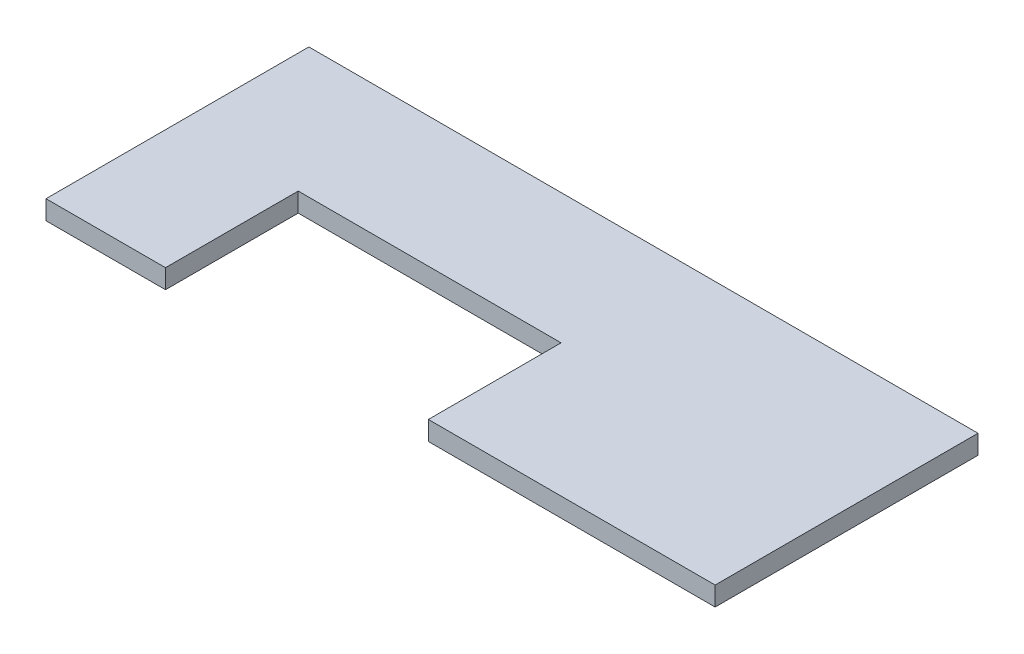
ISO-10303-21;
HEADER;
FILE_DESCRIPTION(('STEP AP214'),'2;1');
FILE_NAME('part.step','',(''),(''),'','','');
FILE_SCHEMA(('AUTOMOTIVE_DESIGN { 1 0 10303 214 1 1 1 1 }'));
ENDSEC;
DATA;
#1=APPLICATION_CONTEXT('core data for automotive mechanical design processes');
#2=APPLICATION_PROTOCOL_DEFINITION('international standard','automotive_design',2000,#1);
#3=PRODUCT_CONTEXT('',#1,'mechanical');
#4=PRODUCT('Part','Part','',(#3));
#5=PRODUCT_RELATED_PRODUCT_CATEGORY('part','',(#4));
#6=PRODUCT_DEFINITION_FORMATION('','',#4);
#7=PRODUCT_DEFINITION_CONTEXT('part definition',#1,'design');
#8=PRODUCT_DEFINITION('design','',#6,#7);
#9=PRODUCT_DEFINITION_SHAPE('','',#8);
#10=(LENGTH_UNIT() NAMED_UNIT(*) SI_UNIT(.MILLI.,.METRE.));
#11=(NAMED_UNIT(*) PLANE_ANGLE_UNIT() SI_UNIT($,.RADIAN.));
#12=(NAMED_UNIT(*) SI_UNIT($,.STERADIAN.) SOLID_ANGLE_UNIT());
#13=UNCERTAINTY_MEASURE_WITH_UNIT(LENGTH_MEASURE(1.E-05),#10,'distance_accuracy_value','');
#14=(GEOMETRIC_REPRESENTATION_CONTEXT(3) GLOBAL_UNCERTAINTY_ASSIGNED_CONTEXT((#13)) GLOBAL_UNIT_ASSIGNED_CONTEXT((#10,
#11,#12)) REPRESENTATION_CONTEXT('',''));
#15=CARTESIAN_POINT('',(0.,0.,0.));
#16=DIRECTION('',(0.,0.,1.));
#17=DIRECTION('',(1.,0.,0.));
#18=AXIS2_PLACEMENT_3D('',#15,#16,#17);
#19=CARTESIAN_POINT('',(-196.239669421488,4.,-35.2892561983471));
#20=DIRECTION('',(1.,0.,0.));
#21=DIRECTION('',(0.,0.,-1.));
#22=AXIS2_PLACEMENT_3D('',#19,#20,#21);
#23=PLANE('',#22);
#24=DIRECTION('',(0.,0.,1.));
#25=VECTOR('',#24,1.);
#26=CARTESIAN_POINT('',(-196.239669421488,0.,-35.2892561983471));
#27=LINE('',#26,#25);
#28=CARTESIAN_POINT('',(-196.239669421488,0.,-90.2892561983471));
#29=VERTEX_POINT('',#28);
#30=CARTESIAN_POINT('',(-196.239669421488,0.,-35.2892561983471));
#31=VERTEX_POINT('',#30);
#32=EDGE_CURVE('E129',#29,#31,#27,.T.);
#33=ORIENTED_EDGE('',*,*,#32,.T.);
#34=DIRECTION('',(0.,-1.,0.));
#35=VECTOR('',#34,1.);
#36=CARTESIAN_POINT('',(-196.239669421488,4.,-35.2892561983471));
#37=LINE('',#36,#35);
#38=CARTESIAN_POINT('',(-196.239669421488,4.,-35.2892561983471));
#39=VERTEX_POINT('',#38);
#40=EDGE_CURVE('E11',#39,#31,#37,.T.);
#41=ORIENTED_EDGE('',*,*,#40,.F.);
#42=DIRECTION('',(0.,0.,1.));
#43=VECTOR('',#42,1.);
#44=CARTESIAN_POINT('',(-196.239669421488,4.,-35.2892561983471));
#45=LINE('',#44,#43);
#46=CARTESIAN_POINT('',(-196.239669421488,4.,-90.2892561983471));
#47=VERTEX_POINT('',#46);
#48=EDGE_CURVE('E143',#47,#39,#45,.T.);
#49=ORIENTED_EDGE('',*,*,#48,.F.);
#50=DIRECTION('',(0.,-1.,0.));
#51=VECTOR('',#50,1.);
#52=CARTESIAN_POINT('',(-196.239669421488,4.,-90.2892561983471));
#53=LINE('',#52,#51);
#54=EDGE_CURVE('E125',#47,#29,#53,.T.);
#55=ORIENTED_EDGE('',*,*,#54,.T.);
#56=EDGE_LOOP('',(#33,#41,#49,#55));
#57=FACE_BOUND('',#56,.T.);
#58=ADVANCED_FACE('F33',(#57),#23,.F.);
#59=CARTESIAN_POINT('',(-171.239669421488,4.,-35.2892561983471));
#60=DIRECTION('',(0.,0.,-1.));
#61=DIRECTION('',(-1.,0.,0.));
#62=AXIS2_PLACEMENT_3D('',#59,#60,#61);
#63=PLANE('',#62);
#64=DIRECTION('',(1.,0.,0.));
#65=VECTOR('',#64,1.);
#66=CARTESIAN_POINT('',(-171.239669421488,0.,-35.2892561983471));
#67=LINE('',#66,#65);
#68=CARTESIAN_POINT('',(-171.239669421488,0.,-35.2892561983471));
#69=VERTEX_POINT('',#68);
#70=EDGE_CURVE('E132',#31,#69,#67,.T.);
#71=ORIENTED_EDGE('',*,*,#70,.T.);
#72=DIRECTION('',(0.,-1.,0.));
#73=VECTOR('',#72,1.);
#74=CARTESIAN_POINT('',(-171.239669421488,4.,-35.2892561983471));
#75=LINE('',#74,#73);
#76=CARTESIAN_POINT('',(-171.239669421488,4.,-35.2892561983471));
#77=VERTEX_POINT('',#76);
#78=EDGE_CURVE('E41',#77,#69,#75,.T.);
#79=ORIENTED_EDGE('',*,*,#78,.F.);
#80=DIRECTION('',(1.,0.,0.));
#81=VECTOR('',#80,1.);
#82=CARTESIAN_POINT('',(-171.239669421488,4.,-35.2892561983471));
#83=LINE('',#82,#81);
#84=EDGE_CURVE('E92',#39,#77,#83,.T.);
#85=ORIENTED_EDGE('',*,*,#84,.F.);
#86=ORIENTED_EDGE('',*,*,#40,.T.);
#87=EDGE_LOOP('',(#71,#79,#85,#86));
#88=FACE_BOUND('',#87,.T.);
#89=ADVANCED_FACE('F178',(#88),#63,.F.);
#90=CARTESIAN_POINT('',(-171.239669421488,4.,-63.0578512396694));
#91=DIRECTION('',(-1.,0.,0.));
#92=DIRECTION('',(0.,0.,1.));
#93=AXIS2_PLACEMENT_3D('',#90,#91,#92);
#94=PLANE('',#93);
#95=DIRECTION('',(0.,0.,-1.));
#96=VECTOR('',#95,1.);
#97=CARTESIAN_POINT('',(-171.239669421488,0.,-63.0578512396694));
#98=LINE('',#97,#96);
#99=CARTESIAN_POINT('',(-171.239669421488,0.,-63.0578512396694));
#100=VERTEX_POINT('',#99);
#101=EDGE_CURVE('E134',#69,#100,#98,.T.);
#102=ORIENTED_EDGE('',*,*,#101,.T.);
#103=DIRECTION('',(0.,-1.,0.));
#104=VECTOR('',#103,1.);
#105=CARTESIAN_POINT('',(-171.239669421488,4.,-63.0578512396694));
#106=LINE('',#105,#104);
#107=CARTESIAN_POINT('',(-171.239669421488,4.,-63.0578512396694));
#108=VERTEX_POINT('',#107);
#109=EDGE_CURVE('E150',#108,#100,#106,.T.);
#110=ORIENTED_EDGE('',*,*,#109,.F.);
#111=DIRECTION('',(0.,0.,-1.));
#112=VECTOR('',#111,1.);
#113=CARTESIAN_POINT('',(-171.239669421488,4.,-63.0578512396694));
#114=LINE('',#113,#112);
#115=EDGE_CURVE('E158',#77,#108,#114,.T.);
#116=ORIENTED_EDGE('',*,*,#115,.F.);
#117=ORIENTED_EDGE('',*,*,#78,.T.);
#118=EDGE_LOOP('',(#102,#110,#116,#117));
#119=FACE_BOUND('',#118,.T.);
#120=ADVANCED_FACE('F156',(#119),#94,.F.);
#121=CARTESIAN_POINT('',(-116.239669421488,4.,-63.0578512396694));
#122=DIRECTION('',(0.,0.,-1.));
#123=DIRECTION('',(-1.,0.,0.));
#124=AXIS2_PLACEMENT_3D('',#121,#122,#123);
#125=PLANE('',#124);
#126=DIRECTION('',(1.,0.,0.));
#127=VECTOR('',#126,1.);
#128=CARTESIAN_POINT('',(-116.239669421488,0.,-63.0578512396694));
#129=LINE('',#128,#127);
#130=CARTESIAN_POINT('',(-116.239669421488,0.,-63.0578512396694));
#131=VERTEX_POINT('',#130);
#132=EDGE_CURVE('E136',#100,#131,#129,.T.);
#133=ORIENTED_EDGE('',*,*,#132,.T.);
#134=DIRECTION('',(0.,-1.,0.));
#135=VECTOR('',#134,1.);
#136=CARTESIAN_POINT('',(-116.239669421488,4.,-63.0578512396694));
#137=LINE('',#136,#135);
#138=CARTESIAN_POINT('',(-116.239669421488,4.,-63.0578512396694));
#139=VERTEX_POINT('',#138);
#140=EDGE_CURVE('E147',#139,#131,#137,.T.);
#141=ORIENTED_EDGE('',*,*,#140,.F.);
#142=DIRECTION('',(1.,0.,0.));
#143=VECTOR('',#142,1.);
#144=CARTESIAN_POINT('',(-116.239669421488,4.,-63.0578512396694));
#145=LINE('',#144,#143);
#146=EDGE_CURVE('E170',#108,#139,#145,.T.);
#147=ORIENTED_EDGE('',*,*,#146,.F.);
#148=ORIENTED_EDGE('',*,*,#109,.T.);
#149=EDGE_LOOP('',(#133,#141,#147,#148));
#150=FACE_BOUND('',#149,.T.);
#151=ADVANCED_FACE('F166',(#150),#125,.F.);
#152=CARTESIAN_POINT('',(-116.239669421488,4.,-35.2892561983471));
#153=DIRECTION('',(1.,0.,0.));
#154=DIRECTION('',(0.,0.,-1.));
#155=AXIS2_PLACEMENT_3D('',#152,#153,#154);
#156=PLANE('',#155);
#157=DIRECTION('',(0.,0.,1.));
#158=VECTOR('',#157,1.);
#159=CARTESIAN_POINT('',(-116.239669421488,0.,-35.2892561983471));
#160=LINE('',#159,#158);
#161=CARTESIAN_POINT('',(-116.239669421488,0.,-35.2892561983471));
#162=VERTEX_POINT('',#161);
#163=EDGE_CURVE('E138',#131,#162,#160,.T.);
#164=ORIENTED_EDGE('',*,*,#163,.T.);
#165=DIRECTION('',(0.,-1.,0.));
#166=VECTOR('',#165,1.);
#167=CARTESIAN_POINT('',(-116.239669421488,4.,-35.2892561983471));
#168=LINE('',#167,#166);
#169=CARTESIAN_POINT('',(-116.239669421488,4.,-35.2892561983471));
#170=VERTEX_POINT('',#169);
#171=EDGE_CURVE('E120',#170,#162,#168,.T.);
#172=ORIENTED_EDGE('',*,*,#171,.F.);
#173=DIRECTION('',(0.,0.,1.));
#174=VECTOR('',#173,1.);
#175=CARTESIAN_POINT('',(-116.239669421488,4.,-35.2892561983471));
#176=LINE('',#175,#174);
#177=EDGE_CURVE('E111',#139,#170,#176,.T.);
#178=ORIENTED_EDGE('',*,*,#177,.F.);
#179=ORIENTED_EDGE('',*,*,#140,.T.);
#180=EDGE_LOOP('',(#164,#172,#178,#179));
#181=FACE_BOUND('',#180,.T.);
#182=ADVANCED_FACE('F169',(#181),#156,.F.);
#183=CARTESIAN_POINT('',(-56.2396694214876,4.,-35.2892561983471));
#184=DIRECTION('',(0.,0.,-1.));
#185=DIRECTION('',(-1.,0.,0.));
#186=AXIS2_PLACEMENT_3D('',#183,#184,#185);
#187=PLANE('',#186);
#188=DIRECTION('',(1.,0.,0.));
#189=VECTOR('',#188,1.);
#190=CARTESIAN_POINT('',(-56.2396694214876,0.,-35.2892561983471));
#191=LINE('',#190,#189);
#192=CARTESIAN_POINT('',(-56.2396694214876,0.,-35.2892561983471));
#193=VERTEX_POINT('',#192);
#194=EDGE_CURVE('E119',#162,#193,#191,.T.);
#195=ORIENTED_EDGE('',*,*,#194,.T.);
#196=DIRECTION('',(0.,-1.,0.));
#197=VECTOR('',#196,1.);
#198=CARTESIAN_POINT('',(-56.2396694214876,4.,-35.2892561983471));
#199=LINE('',#198,#197);
#200=CARTESIAN_POINT('',(-56.2396694214876,4.,-35.2892561983471));
#201=VERTEX_POINT('',#200);
#202=EDGE_CURVE('E116',#201,#193,#199,.T.);
#203=ORIENTED_EDGE('',*,*,#202,.F.);
#204=DIRECTION('',(1.,0.,0.));
#205=VECTOR('',#204,1.);
#206=CARTESIAN_POINT('',(-56.2396694214876,4.,-35.2892561983471));
#207=LINE('',#206,#205);
#208=EDGE_CURVE('E105',#170,#201,#207,.T.);
#209=ORIENTED_EDGE('',*,*,#208,.F.);
#210=ORIENTED_EDGE('',*,*,#171,.T.);
#211=EDGE_LOOP('',(#195,#203,#209,#210));
#212=FACE_BOUND('',#211,.T.);
#213=ADVANCED_FACE('F117',(#212),#187,.F.);
#214=CARTESIAN_POINT('',(-56.2396694214876,4.,-90.2892561983471));
#215=DIRECTION('',(-1.,0.,0.));
#216=DIRECTION('',(0.,0.,1.));
#217=AXIS2_PLACEMENT_3D('',#214,#215,#216);
#218=PLANE('',#217);
#219=DIRECTION('',(0.,0.,-1.));
#220=VECTOR('',#219,1.);
#221=CARTESIAN_POINT('',(-56.2396694214876,0.,-90.2892561983471));
#222=LINE('',#221,#220);
#223=CARTESIAN_POINT('',(-56.2396694214876,0.,-90.2892561983471));
#224=VERTEX_POINT('',#223);
#225=EDGE_CURVE('E78',#193,#224,#222,.T.);
#226=ORIENTED_EDGE('',*,*,#225,.T.);
#227=DIRECTION('',(0.,-1.,0.));
#228=VECTOR('',#227,1.);
#229=CARTESIAN_POINT('',(-56.2396694214876,4.,-90.2892561983471));
#230=LINE('',#229,#228);
#231=CARTESIAN_POINT('',(-56.2396694214876,4.,-90.2892561983471));
#232=VERTEX_POINT('',#231);
#233=EDGE_CURVE('E121',#232,#224,#230,.T.);
#234=ORIENTED_EDGE('',*,*,#233,.F.);
#235=DIRECTION('',(0.,0.,-1.));
#236=VECTOR('',#235,1.);
#237=CARTESIAN_POINT('',(-56.2396694214876,4.,-90.2892561983471));
#238=LINE('',#237,#236);
#239=EDGE_CURVE('E109',#201,#232,#238,.T.);
#240=ORIENTED_EDGE('',*,*,#239,.F.);
#241=ORIENTED_EDGE('',*,*,#202,.T.);
#242=EDGE_LOOP('',(#226,#234,#240,#241));
#243=FACE_BOUND('',#242,.T.);
#244=ADVANCED_FACE('F123',(#243),#218,.F.);
#245=CARTESIAN_POINT('',(-196.239669421488,4.,-90.2892561983471));
#246=DIRECTION('',(0.,0.,1.));
#247=DIRECTION('',(1.,0.,0.));
#248=AXIS2_PLACEMENT_3D('',#245,#246,#247);
#249=PLANE('',#248);
#250=DIRECTION('',(-1.,0.,0.));
#251=VECTOR('',#250,1.);
#252=CARTESIAN_POINT('',(-196.239669421488,0.,-90.2892561983471));
#253=LINE('',#252,#251);
#254=EDGE_CURVE('E84',#224,#29,#253,.T.);
#255=ORIENTED_EDGE('',*,*,#254,.T.);
#256=ORIENTED_EDGE('',*,*,#54,.F.);
#257=DIRECTION('',(-1.,0.,0.));
#258=VECTOR('',#257,1.);
#259=CARTESIAN_POINT('',(-196.239669421488,4.,-90.2892561983471));
#260=LINE('',#259,#258);
#261=EDGE_CURVE('E49',#232,#47,#260,.T.);
#262=ORIENTED_EDGE('',*,*,#261,.F.);
#263=ORIENTED_EDGE('',*,*,#233,.T.);
#264=EDGE_LOOP('',(#255,#256,#262,#263));
#265=FACE_BOUND('',#264,.T.);
#266=ADVANCED_FACE('F194',(#265),#249,.F.);
#267=CARTESIAN_POINT('',(0.,4.,0.));
#268=DIRECTION('',(0.,-1.,0.));
#269=DIRECTION('',(0.,0.,-1.));
#270=AXIS2_PLACEMENT_3D('',#267,#268,#269);
#271=PLANE('',#270);
#272=ORIENTED_EDGE('',*,*,#48,.T.);
#273=ORIENTED_EDGE('',*,*,#84,.T.);
#274=ORIENTED_EDGE('',*,*,#115,.T.);
#275=ORIENTED_EDGE('',*,*,#146,.T.);
#276=ORIENTED_EDGE('',*,*,#177,.T.);
#277=ORIENTED_EDGE('',*,*,#208,.T.);
#278=ORIENTED_EDGE('',*,*,#239,.T.);
#279=ORIENTED_EDGE('',*,*,#261,.T.);
#280=EDGE_LOOP('',(#272,#273,#274,#275,#276,#277,#278,#279));
#281=FACE_BOUND('',#280,.T.);
#282=ADVANCED_FACE('F107',(#281),#271,.F.);
#283=CARTESIAN_POINT('',(0.,0.,0.));
#284=DIRECTION('',(0.,-1.,0.));
#285=DIRECTION('',(0.,0.,-1.));
#286=AXIS2_PLACEMENT_3D('',#283,#284,#285);
#287=PLANE('',#286);
#288=ORIENTED_EDGE('',*,*,#32,.F.);
#289=ORIENTED_EDGE('',*,*,#254,.F.);
#290=ORIENTED_EDGE('',*,*,#225,.F.);
#291=ORIENTED_EDGE('',*,*,#194,.F.);
#292=ORIENTED_EDGE('',*,*,#163,.F.);
#293=ORIENTED_EDGE('',*,*,#132,.F.);
#294=ORIENTED_EDGE('',*,*,#101,.F.);
#295=ORIENTED_EDGE('',*,*,#70,.F.);
#296=EDGE_LOOP('',(#288,#289,#290,#291,#292,#293,#294,#295));
#297=FACE_BOUND('',#296,.T.);
#298=ADVANCED_FACE('F162',(#297),#287,.T.);
#299=CLOSED_SHELL('',(#58,#89,#120,#151,#182,#213,#244,#266,#282,#298));
#300=MANIFOLD_SOLID_BREP('B2',#299);
#301=ADVANCED_BREP_SHAPE_REPRESENTATION('',(#18,#300),#14);
#302=SHAPE_DEFINITION_REPRESENTATION(#9,#301);
ENDSEC;
END-ISO-10303-21;
